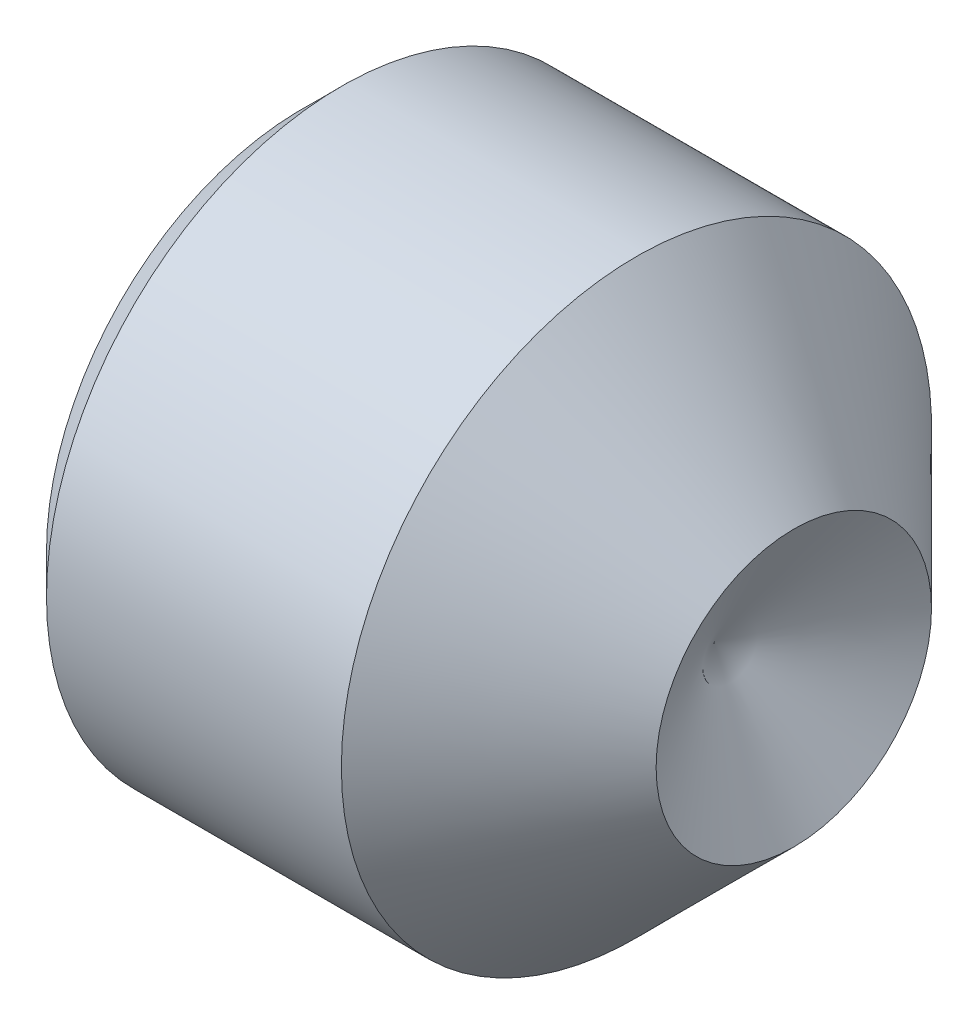
ISO-10303-21;
HEADER;
FILE_DESCRIPTION(('STEP AP214'),'2;1');
FILE_NAME('part.step','',(''),(''),'','','');
FILE_SCHEMA(('AUTOMOTIVE_DESIGN { 1 0 10303 214 1 1 1 1 }'));
ENDSEC;
DATA;
#1=APPLICATION_CONTEXT('core data for automotive mechanical design processes');
#2=APPLICATION_PROTOCOL_DEFINITION('international standard','automotive_design',2000,#1);
#3=PRODUCT_CONTEXT('',#1,'mechanical');
#4=PRODUCT('Part','Part','',(#3));
#5=PRODUCT_RELATED_PRODUCT_CATEGORY('part','',(#4));
#6=PRODUCT_DEFINITION_FORMATION('','',#4);
#7=PRODUCT_DEFINITION_CONTEXT('part definition',#1,'design');
#8=PRODUCT_DEFINITION('design','',#6,#7);
#9=PRODUCT_DEFINITION_SHAPE('','',#8);
#10=(LENGTH_UNIT() NAMED_UNIT(*) SI_UNIT(.MILLI.,.METRE.));
#11=(NAMED_UNIT(*) PLANE_ANGLE_UNIT() SI_UNIT($,.RADIAN.));
#12=(NAMED_UNIT(*) SI_UNIT($,.STERADIAN.) SOLID_ANGLE_UNIT());
#13=UNCERTAINTY_MEASURE_WITH_UNIT(LENGTH_MEASURE(1.E-05),#10,'distance_accuracy_value','');
#14=(GEOMETRIC_REPRESENTATION_CONTEXT(3) GLOBAL_UNCERTAINTY_ASSIGNED_CONTEXT((#13)) GLOBAL_UNIT_ASSIGNED_CONTEXT((#10,
#11,#12)) REPRESENTATION_CONTEXT('',''));
#15=CARTESIAN_POINT('',(0.,0.,0.));
#16=DIRECTION('',(0.,0.,1.));
#17=DIRECTION('',(1.,0.,0.));
#18=AXIS2_PLACEMENT_3D('',#15,#16,#17);
#19=CARTESIAN_POINT('',(1.2,0.749111974273539,1.2975));
#20=DIRECTION('',(-1.,0.,0.));
#21=DIRECTION('',(0.,0.,1.));
#22=AXIS2_PLACEMENT_3D('',#19,#20,#21);
#23=PLANE('',#22);
#24=CARTESIAN_POINT('',(1.2,0.,0.));
#25=DIRECTION('',(-1.,0.,0.));
#26=DIRECTION('',(0.,0.,1.));
#27=AXIS2_PLACEMENT_3D('',#24,#25,#26);
#28=CIRCLE('',#27,0.749111974273539);
#29=CARTESIAN_POINT('',(1.2,0.37455598713677,0.64875));
#30=VERTEX_POINT('',#29);
#31=CARTESIAN_POINT('',(1.2,0.749111974273539,0.));
#32=VERTEX_POINT('',#31);
#33=EDGE_CURVE('E52',#30,#32,#28,.T.);
#34=ORIENTED_EDGE('',*,*,#33,.F.);
#35=DIRECTION('',(0.,0.866025403784438,-0.5));
#36=VECTOR('',#35,1.);
#37=CARTESIAN_POINT('',(1.2,0.,0.864999999999999));
#38=LINE('',#37,#36);
#39=CARTESIAN_POINT('',(1.2,0.749111974273539,0.432499999999999));
#40=VERTEX_POINT('',#39);
#41=EDGE_CURVE('E137',#30,#40,#38,.T.);
#42=ORIENTED_EDGE('',*,*,#41,.T.);
#43=DIRECTION('',(0.,0.,-1.));
#44=VECTOR('',#43,1.);
#45=CARTESIAN_POINT('',(1.2,0.749111974273539,0.432499999999999));
#46=LINE('',#45,#44);
#47=EDGE_CURVE('E143',#40,#32,#46,.T.);
#48=ORIENTED_EDGE('',*,*,#47,.T.);
#49=EDGE_LOOP('',(#34,#42,#48));
#50=FACE_BOUND('',#49,.T.);
#51=ADVANCED_FACE('F41',(#50),#23,.T.);
#52=CARTESIAN_POINT('',(1.2,0.374555987136769,-0.64875));
#53=VERTEX_POINT('',#52);
#54=EDGE_CURVE('E11',#32,#53,#28,.T.);
#55=ORIENTED_EDGE('',*,*,#54,.F.);
#56=CARTESIAN_POINT('',(1.2,0.749111974273539,-0.432500000000001));
#57=VERTEX_POINT('',#56);
#58=EDGE_CURVE('E142',#32,#57,#46,.T.);
#59=ORIENTED_EDGE('',*,*,#58,.T.);
#60=DIRECTION('',(0.,-0.866025403784439,-0.5));
#61=VECTOR('',#60,1.);
#62=CARTESIAN_POINT('',(1.2,0.749111974273539,-0.432500000000001));
#63=LINE('',#62,#61);
#64=EDGE_CURVE('E147',#57,#53,#63,.T.);
#65=ORIENTED_EDGE('',*,*,#64,.T.);
#66=EDGE_LOOP('',(#55,#59,#65));
#67=FACE_BOUND('',#66,.T.);
#68=ADVANCED_FACE('F242',(#67),#23,.T.);
#69=CARTESIAN_POINT('',(1.2,-0.37455598713677,-0.64875));
#70=VERTEX_POINT('',#69);
#71=EDGE_CURVE('E50',#53,#70,#28,.T.);
#72=ORIENTED_EDGE('',*,*,#71,.F.);
#73=CARTESIAN_POINT('',(1.2,0.,-0.865));
#74=VERTEX_POINT('',#73);
#75=EDGE_CURVE('E146',#53,#74,#63,.T.);
#76=ORIENTED_EDGE('',*,*,#75,.T.);
#77=DIRECTION('',(0.,-0.866025403784439,0.5));
#78=VECTOR('',#77,1.);
#79=CARTESIAN_POINT('',(1.2,0.,-0.865));
#80=LINE('',#79,#78);
#81=EDGE_CURVE('E151',#74,#70,#80,.T.);
#82=ORIENTED_EDGE('',*,*,#81,.T.);
#83=EDGE_LOOP('',(#72,#76,#82));
#84=FACE_BOUND('',#83,.T.);
#85=ADVANCED_FACE('F211',(#84),#23,.T.);
#86=CARTESIAN_POINT('',(1.2,-0.749111974273539,0.));
#87=VERTEX_POINT('',#86);
#88=EDGE_CURVE('E196',#70,#87,#28,.T.);
#89=ORIENTED_EDGE('',*,*,#88,.F.);
#90=CARTESIAN_POINT('',(1.2,-0.74911197427354,-0.4325));
#91=VERTEX_POINT('',#90);
#92=EDGE_CURVE('E150',#70,#91,#80,.T.);
#93=ORIENTED_EDGE('',*,*,#92,.T.);
#94=DIRECTION('',(0.,0.,1.));
#95=VECTOR('',#94,1.);
#96=CARTESIAN_POINT('',(1.2,-0.74911197427354,-0.4325));
#97=LINE('',#96,#95);
#98=EDGE_CURVE('E155',#91,#87,#97,.T.);
#99=ORIENTED_EDGE('',*,*,#98,.T.);
#100=EDGE_LOOP('',(#89,#93,#99));
#101=FACE_BOUND('',#100,.T.);
#102=ADVANCED_FACE('F205',(#101),#23,.T.);
#103=CARTESIAN_POINT('',(1.2,-0.374555987136769,0.64875));
#104=VERTEX_POINT('',#103);
#105=EDGE_CURVE('E59',#87,#104,#28,.T.);
#106=ORIENTED_EDGE('',*,*,#105,.F.);
#107=CARTESIAN_POINT('',(1.2,-0.74911197427354,0.432499999999999));
#108=VERTEX_POINT('',#107);
#109=EDGE_CURVE('E154',#87,#108,#97,.T.);
#110=ORIENTED_EDGE('',*,*,#109,.T.);
#111=DIRECTION('',(0.,0.866025403784439,0.5));
#112=VECTOR('',#111,1.);
#113=CARTESIAN_POINT('',(1.2,-0.74911197427354,0.432499999999999));
#114=LINE('',#113,#112);
#115=EDGE_CURVE('E134',#108,#104,#114,.T.);
#116=ORIENTED_EDGE('',*,*,#115,.T.);
#117=EDGE_LOOP('',(#106,#110,#116));
#118=FACE_BOUND('',#117,.T.);
#119=ADVANCED_FACE('F228',(#118),#23,.T.);
#120=CARTESIAN_POINT('',(0.,1.299,0.));
#121=DIRECTION('',(1.,0.,0.));
#122=DIRECTION('',(0.,0.,-1.));
#123=AXIS2_PLACEMENT_3D('',#120,#121,#122);
#124=PLANE('',#123);
#125=DIRECTION('',(0.,0.866025403784438,-0.5));
#126=VECTOR('',#125,1.);
#127=CARTESIAN_POINT('',(0.,0.,0.864999999999999));
#128=LINE('',#127,#126);
#129=CARTESIAN_POINT('',(0.,0.,0.864999999999999));
#130=VERTEX_POINT('',#129);
#131=CARTESIAN_POINT('',(0.,0.749111974273539,0.432499999999999));
#132=VERTEX_POINT('',#131);
#133=EDGE_CURVE('E160',#130,#132,#128,.T.);
#134=ORIENTED_EDGE('',*,*,#133,.F.);
#135=DIRECTION('',(0.,0.866025403784439,0.5));
#136=VECTOR('',#135,1.);
#137=CARTESIAN_POINT('',(0.,-0.74911197427354,0.432499999999999));
#138=LINE('',#137,#136);
#139=CARTESIAN_POINT('',(0.,-0.74911197427354,0.432499999999999));
#140=VERTEX_POINT('',#139);
#141=EDGE_CURVE('E67',#140,#130,#138,.T.);
#142=ORIENTED_EDGE('',*,*,#141,.F.);
#143=DIRECTION('',(0.,0.,1.));
#144=VECTOR('',#143,1.);
#145=CARTESIAN_POINT('',(0.,-0.74911197427354,-0.4325));
#146=LINE('',#145,#144);
#147=CARTESIAN_POINT('',(0.,-0.74911197427354,-0.4325));
#148=VERTEX_POINT('',#147);
#149=EDGE_CURVE('E172',#148,#140,#146,.T.);
#150=ORIENTED_EDGE('',*,*,#149,.F.);
#151=DIRECTION('',(0.,-0.866025403784439,0.5));
#152=VECTOR('',#151,1.);
#153=CARTESIAN_POINT('',(0.,0.,-0.865));
#154=LINE('',#153,#152);
#155=CARTESIAN_POINT('',(0.,0.,-0.865));
#156=VERTEX_POINT('',#155);
#157=EDGE_CURVE('E169',#156,#148,#154,.T.);
#158=ORIENTED_EDGE('',*,*,#157,.F.);
#159=DIRECTION('',(0.,-0.866025403784439,-0.5));
#160=VECTOR('',#159,1.);
#161=CARTESIAN_POINT('',(0.,0.749111974273539,-0.432500000000001));
#162=LINE('',#161,#160);
#163=CARTESIAN_POINT('',(0.,0.749111974273539,-0.432500000000001));
#164=VERTEX_POINT('',#163);
#165=EDGE_CURVE('E166',#164,#156,#162,.T.);
#166=ORIENTED_EDGE('',*,*,#165,.F.);
#167=DIRECTION('',(0.,0.,-1.));
#168=VECTOR('',#167,1.);
#169=CARTESIAN_POINT('',(0.,0.749111974273539,0.432499999999999));
#170=LINE('',#169,#168);
#171=EDGE_CURVE('E163',#132,#164,#170,.T.);
#172=ORIENTED_EDGE('',*,*,#171,.F.);
#173=EDGE_LOOP('',(#134,#142,#150,#158,#166,#172));
#174=FACE_BOUND('',#173,.T.);
#175=CARTESIAN_POINT('',(0.,0.,0.));
#176=DIRECTION('',(-1.,0.,0.));
#177=DIRECTION('',(0.,0.,1.));
#178=AXIS2_PLACEMENT_3D('',#175,#176,#177);
#179=CIRCLE('',#178,1.299);
#180=CARTESIAN_POINT('',(0.,0.,1.299));
#181=VERTEX_POINT('',#180);
#182=EDGE_CURVE('E177',#181,#181,#179,.T.);
#183=ORIENTED_EDGE('',*,*,#182,.T.);
#184=EDGE_LOOP('',(#183));
#185=FACE_BOUND('',#184,.T.);
#186=ADVANCED_FACE('F43',(#174,#185),#124,.F.);
#187=CARTESIAN_POINT('',(2.5,0.,0.));
#188=DIRECTION('',(-1.,0.,0.));
#189=DIRECTION('',(0.,0.,1.));
#190=AXIS2_PLACEMENT_3D('',#187,#188,#189);
#191=CONICAL_SURFACE('',#190,0.7,0.785398163397448);
#192=CARTESIAN_POINT('',(1.70000000000001,0.,0.));
#193=DIRECTION('',(-1.,0.,0.));
#194=DIRECTION('',(0.,0.,1.));
#195=AXIS2_PLACEMENT_3D('',#192,#193,#194);
#196=CIRCLE('',#195,1.5);
#197=CARTESIAN_POINT('',(1.70000000000001,0.,1.5));
#198=VERTEX_POINT('',#197);
#199=EDGE_CURVE('E45',#198,#198,#196,.T.);
#200=ORIENTED_EDGE('',*,*,#199,.F.);
#201=EDGE_LOOP('',(#200));
#202=FACE_BOUND('',#201,.T.);
#203=CARTESIAN_POINT('',(2.5,0.,0.));
#204=DIRECTION('',(-1.,0.,0.));
#205=DIRECTION('',(0.,-1.,0.));
#206=AXIS2_PLACEMENT_3D('',#203,#204,#205);
#207=CIRCLE('',#206,0.700000000000004);
#208=CARTESIAN_POINT('',(2.5,-0.700000000000008,0.));
#209=VERTEX_POINT('',#208);
#210=EDGE_CURVE('E126',#209,#209,#207,.T.);
#211=ORIENTED_EDGE('',*,*,#210,.T.);
#212=EDGE_LOOP('',(#211));
#213=FACE_BOUND('',#212,.T.);
#214=ADVANCED_FACE('F271',(#202,#213),#191,.T.);
#215=CARTESIAN_POINT('',(-0.262128325508607,0.,0.));
#216=DIRECTION('',(-1.,0.,0.));
#217=DIRECTION('',(0.,0.,1.));
#218=AXIS2_PLACEMENT_3D('',#215,#216,#217);
#219=CYLINDRICAL_SURFACE('',#218,1.5);
#220=CARTESIAN_POINT('',(0.200999999999998,0.,0.));
#221=DIRECTION('',(-1.,0.,0.));
#222=DIRECTION('',(0.,0.,1.));
#223=AXIS2_PLACEMENT_3D('',#220,#221,#222);
#224=CIRCLE('',#223,1.49999999999999);
#225=CARTESIAN_POINT('',(0.200999999999998,0.,1.49999999999999));
#226=VERTEX_POINT('',#225);
#227=EDGE_CURVE('E188',#226,#226,#224,.T.);
#228=ORIENTED_EDGE('',*,*,#227,.F.);
#229=EDGE_LOOP('',(#228));
#230=FACE_BOUND('',#229,.T.);
#231=ORIENTED_EDGE('',*,*,#199,.T.);
#232=EDGE_LOOP('',(#231));
#233=FACE_BOUND('',#232,.T.);
#234=ADVANCED_FACE('F305',(#230,#233),#219,.T.);
#235=CARTESIAN_POINT('',(0.200999999999998,0.,0.));
#236=DIRECTION('',(1.,0.,0.));
#237=DIRECTION('',(0.,0.,-1.));
#238=AXIS2_PLACEMENT_3D('',#235,#236,#237);
#239=CONICAL_SURFACE('',#238,1.49999999999999,0.785398163397443);
#240=ORIENTED_EDGE('',*,*,#182,.F.);
#241=EDGE_LOOP('',(#240));
#242=FACE_BOUND('',#241,.T.);
#243=ORIENTED_EDGE('',*,*,#227,.T.);
#244=EDGE_LOOP('',(#243));
#245=FACE_BOUND('',#244,.T.);
#246=ADVANCED_FACE('F300',(#242,#245),#239,.T.);
#247=CARTESIAN_POINT('',(1.2,-0.74911197427354,0.432499999999999));
#248=DIRECTION('',(0.,-0.5,0.866025403784439));
#249=DIRECTION('',(0.,-0.866025403784439,-0.5));
#250=AXIS2_PLACEMENT_3D('',#247,#248,#249);
#251=PLANE('',#250);
#252=ORIENTED_EDGE('',*,*,#141,.T.);
#253=DIRECTION('',(-1.,0.,0.));
#254=VECTOR('',#253,1.);
#255=CARTESIAN_POINT('',(1.2,0.,0.864999999999999));
#256=LINE('',#255,#254);
#257=CARTESIAN_POINT('',(1.2,0.,0.864999999999999));
#258=VERTEX_POINT('',#257);
#259=EDGE_CURVE('E158',#258,#130,#256,.T.);
#260=ORIENTED_EDGE('',*,*,#259,.F.);
#261=EDGE_CURVE('E138',#104,#258,#114,.T.);
#262=ORIENTED_EDGE('',*,*,#261,.F.);
#263=ORIENTED_EDGE('',*,*,#115,.F.);
#264=DIRECTION('',(-1.,0.,0.));
#265=VECTOR('',#264,1.);
#266=CARTESIAN_POINT('',(1.2,-0.74911197427354,0.432499999999999));
#267=LINE('',#266,#265);
#268=EDGE_CURVE('E175',#108,#140,#267,.T.);
#269=ORIENTED_EDGE('',*,*,#268,.T.);
#270=EDGE_LOOP('',(#252,#260,#262,#263,#269));
#271=FACE_BOUND('',#270,.T.);
#272=ADVANCED_FACE('F230',(#271),#251,.F.);
#273=CARTESIAN_POINT('',(1.2,-0.74911197427354,-0.4325));
#274=DIRECTION('',(0.,-1.,0.));
#275=DIRECTION('',(0.,0.,-1.));
#276=AXIS2_PLACEMENT_3D('',#273,#274,#275);
#277=PLANE('',#276);
#278=ORIENTED_EDGE('',*,*,#149,.T.);
#279=ORIENTED_EDGE('',*,*,#268,.F.);
#280=ORIENTED_EDGE('',*,*,#109,.F.);
#281=ORIENTED_EDGE('',*,*,#98,.F.);
#282=DIRECTION('',(-1.,0.,0.));
#283=VECTOR('',#282,1.);
#284=CARTESIAN_POINT('',(1.2,-0.74911197427354,-0.4325));
#285=LINE('',#284,#283);
#286=EDGE_CURVE('E178',#91,#148,#285,.T.);
#287=ORIENTED_EDGE('',*,*,#286,.T.);
#288=EDGE_LOOP('',(#278,#279,#280,#281,#287));
#289=FACE_BOUND('',#288,.T.);
#290=ADVANCED_FACE('F224',(#289),#277,.F.);
#291=CARTESIAN_POINT('',(1.2,0.,-0.865));
#292=DIRECTION('',(0.,-0.5,-0.866025403784439));
#293=DIRECTION('',(0.,0.866025403784439,-0.5));
#294=AXIS2_PLACEMENT_3D('',#291,#292,#293);
#295=PLANE('',#294);
#296=ORIENTED_EDGE('',*,*,#157,.T.);
#297=ORIENTED_EDGE('',*,*,#286,.F.);
#298=ORIENTED_EDGE('',*,*,#92,.F.);
#299=ORIENTED_EDGE('',*,*,#81,.F.);
#300=DIRECTION('',(-1.,0.,0.));
#301=VECTOR('',#300,1.);
#302=CARTESIAN_POINT('',(1.2,0.,-0.865));
#303=LINE('',#302,#301);
#304=EDGE_CURVE('E180',#74,#156,#303,.T.);
#305=ORIENTED_EDGE('',*,*,#304,.T.);
#306=EDGE_LOOP('',(#296,#297,#298,#299,#305));
#307=FACE_BOUND('',#306,.T.);
#308=ADVANCED_FACE('F210',(#307),#295,.F.);
#309=CARTESIAN_POINT('',(1.2,0.749111974273539,-0.432500000000001));
#310=DIRECTION('',(0.,0.5,-0.866025403784439));
#311=DIRECTION('',(0.,0.866025403784439,0.5));
#312=AXIS2_PLACEMENT_3D('',#309,#310,#311);
#313=PLANE('',#312);
#314=ORIENTED_EDGE('',*,*,#165,.T.);
#315=ORIENTED_EDGE('',*,*,#304,.F.);
#316=ORIENTED_EDGE('',*,*,#75,.F.);
#317=ORIENTED_EDGE('',*,*,#64,.F.);
#318=DIRECTION('',(-1.,0.,0.));
#319=VECTOR('',#318,1.);
#320=CARTESIAN_POINT('',(1.2,0.749111974273539,-0.432500000000001));
#321=LINE('',#320,#319);
#322=EDGE_CURVE('E182',#57,#164,#321,.T.);
#323=ORIENTED_EDGE('',*,*,#322,.T.);
#324=EDGE_LOOP('',(#314,#315,#316,#317,#323));
#325=FACE_BOUND('',#324,.T.);
#326=ADVANCED_FACE('F215',(#325),#313,.F.);
#327=CARTESIAN_POINT('',(1.2,0.749111974273539,0.432499999999999));
#328=DIRECTION('',(0.,1.,0.));
#329=DIRECTION('',(0.,0.,1.));
#330=AXIS2_PLACEMENT_3D('',#327,#328,#329);
#331=PLANE('',#330);
#332=ORIENTED_EDGE('',*,*,#171,.T.);
#333=ORIENTED_EDGE('',*,*,#322,.F.);
#334=ORIENTED_EDGE('',*,*,#58,.F.);
#335=ORIENTED_EDGE('',*,*,#47,.F.);
#336=DIRECTION('',(-1.,0.,0.));
#337=VECTOR('',#336,1.);
#338=CARTESIAN_POINT('',(1.2,0.749111974273539,0.432499999999999));
#339=LINE('',#338,#337);
#340=EDGE_CURVE('E184',#40,#132,#339,.T.);
#341=ORIENTED_EDGE('',*,*,#340,.T.);
#342=EDGE_LOOP('',(#332,#333,#334,#335,#341));
#343=FACE_BOUND('',#342,.T.);
#344=ADVANCED_FACE('F245',(#343),#331,.F.);
#345=CARTESIAN_POINT('',(1.2,0.,0.864999999999999));
#346=DIRECTION('',(0.,0.5,0.866025403784438));
#347=DIRECTION('',(0.,-0.866025403784439,0.5));
#348=AXIS2_PLACEMENT_3D('',#345,#346,#347);
#349=PLANE('',#348);
#350=ORIENTED_EDGE('',*,*,#133,.T.);
#351=ORIENTED_EDGE('',*,*,#340,.F.);
#352=ORIENTED_EDGE('',*,*,#41,.F.);
#353=EDGE_CURVE('E139',#258,#30,#38,.T.);
#354=ORIENTED_EDGE('',*,*,#353,.F.);
#355=ORIENTED_EDGE('',*,*,#259,.T.);
#356=EDGE_LOOP('',(#350,#351,#352,#354,#355));
#357=FACE_BOUND('',#356,.T.);
#358=ADVANCED_FACE('F236',(#357),#349,.F.);
#359=EDGE_CURVE('E132',#104,#30,#28,.T.);
#360=ORIENTED_EDGE('',*,*,#359,.F.);
#361=ORIENTED_EDGE('',*,*,#261,.T.);
#362=ORIENTED_EDGE('',*,*,#353,.T.);
#363=EDGE_LOOP('',(#360,#361,#362));
#364=FACE_BOUND('',#363,.T.);
#365=ADVANCED_FACE('F233',(#364),#23,.T.);
#366=CARTESIAN_POINT('',(1.63250000000001,0.,0.));
#367=DIRECTION('',(-1.,0.,0.));
#368=DIRECTION('',(0.,0.,1.));
#369=AXIS2_PLACEMENT_3D('',#366,#367,#368);
#370=CONICAL_SURFACE('',#369,0.,1.04719755119659);
#371=ORIENTED_EDGE('',*,*,#33,.T.);
#372=ORIENTED_EDGE('',*,*,#54,.T.);
#373=ORIENTED_EDGE('',*,*,#71,.T.);
#374=ORIENTED_EDGE('',*,*,#88,.T.);
#375=ORIENTED_EDGE('',*,*,#105,.T.);
#376=ORIENTED_EDGE('',*,*,#359,.T.);
#377=EDGE_LOOP('',(#371,#372,#373,#374,#375,#376));
#378=FACE_BOUND('',#377,.T.);
#379=CARTESIAN_POINT('',(1.63250000000001,0.,0.));
#380=VERTEX_POINT('',#379);
#381=VERTEX_LOOP('',#380);
#382=FACE_BOUND('',#381,.T.);
#383=ADVANCED_FACE('F122',(#378,#382),#370,.F.);
#384=CARTESIAN_POINT('',(2.5,0.,0.));
#385=DIRECTION('',(1.,0.,0.));
#386=DIRECTION('',(0.,1.,0.));
#387=AXIS2_PLACEMENT_3D('',#384,#385,#386);
#388=CONICAL_SURFACE('',#387,0.700000000000004,1.04719755119658);
#389=CARTESIAN_POINT('',(2.09585481156725,0.,0.));
#390=VERTEX_POINT('',#389);
#391=VERTEX_LOOP('',#390);
#392=FACE_BOUND('',#391,.T.);
#393=ORIENTED_EDGE('',*,*,#210,.F.);
#394=EDGE_LOOP('',(#393));
#395=FACE_BOUND('',#394,.T.);
#396=ADVANCED_FACE('F119',(#392,#395),#388,.F.);
#397=CLOSED_SHELL('',(#51,#68,#85,#102,#119,#186,#214,#234,#246,#272,#290,#308,#326,#344,#358,
#365,#383,#396));
#398=MANIFOLD_SOLID_BREP('B2',#397);
#399=ADVANCED_BREP_SHAPE_REPRESENTATION('',(#18,#398),#14);
#400=SHAPE_DEFINITION_REPRESENTATION(#9,#399);
ENDSEC;
END-ISO-10303-21;
